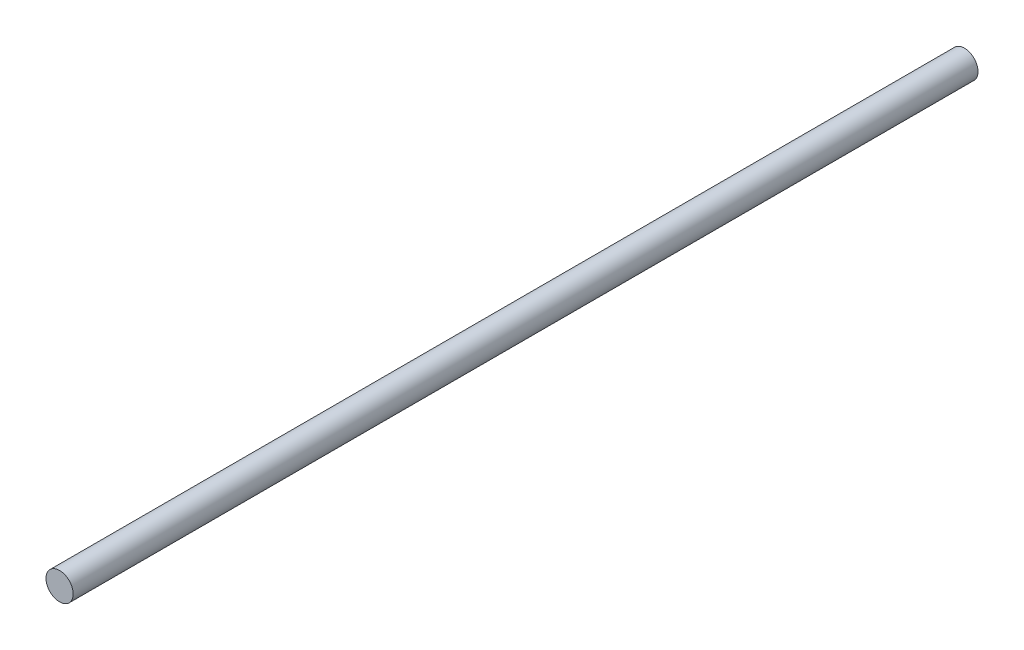
ISO-10303-21;
HEADER;
FILE_DESCRIPTION(('STEP AP214'),'2;1');
FILE_NAME('part.step','',(''),(''),'','','');
FILE_SCHEMA(('AUTOMOTIVE_DESIGN { 1 0 10303 214 1 1 1 1 }'));
ENDSEC;
DATA;
#1=APPLICATION_CONTEXT('core data for automotive mechanical design processes');
#2=APPLICATION_PROTOCOL_DEFINITION('international standard','automotive_design',2000,#1);
#3=PRODUCT_CONTEXT('',#1,'mechanical');
#4=PRODUCT('Part','Part','',(#3));
#5=PRODUCT_RELATED_PRODUCT_CATEGORY('part','',(#4));
#6=PRODUCT_DEFINITION_FORMATION('','',#4);
#7=PRODUCT_DEFINITION_CONTEXT('part definition',#1,'design');
#8=PRODUCT_DEFINITION('design','',#6,#7);
#9=PRODUCT_DEFINITION_SHAPE('','',#8);
#10=(LENGTH_UNIT() NAMED_UNIT(*) SI_UNIT(.MILLI.,.METRE.));
#11=(NAMED_UNIT(*) PLANE_ANGLE_UNIT() SI_UNIT($,.RADIAN.));
#12=(NAMED_UNIT(*) SI_UNIT($,.STERADIAN.) SOLID_ANGLE_UNIT());
#13=UNCERTAINTY_MEASURE_WITH_UNIT(LENGTH_MEASURE(1.E-05),#10,'distance_accuracy_value','');
#14=(GEOMETRIC_REPRESENTATION_CONTEXT(3) GLOBAL_UNCERTAINTY_ASSIGNED_CONTEXT((#13)) GLOBAL_UNIT_ASSIGNED_CONTEXT((#10,
#11,#12)) REPRESENTATION_CONTEXT('',''));
#15=CARTESIAN_POINT('',(0.,0.,0.));
#16=DIRECTION('',(0.,0.,1.));
#17=DIRECTION('',(1.,0.,0.));
#18=AXIS2_PLACEMENT_3D('',#15,#16,#17);
#19=CARTESIAN_POINT('',(0.,0.,199.5));
#20=DIRECTION('',(0.,0.,-1.));
#21=DIRECTION('',(-1.,0.,0.));
#22=AXIS2_PLACEMENT_3D('',#19,#20,#21);
#23=CYLINDRICAL_SURFACE('',#22,3.);
#24=CARTESIAN_POINT('',(0.,0.,199.5));
#25=DIRECTION('',(0.,0.,1.));
#26=DIRECTION('',(1.,0.,0.));
#27=AXIS2_PLACEMENT_3D('',#24,#25,#26);
#28=CIRCLE('',#27,3.);
#29=CARTESIAN_POINT('',(3.,0.,199.5));
#30=VERTEX_POINT('',#29);
#31=EDGE_CURVE('E10',#30,#30,#28,.T.);
#32=ORIENTED_EDGE('',*,*,#31,.F.);
#33=EDGE_LOOP('',(#32));
#34=FACE_BOUND('',#33,.T.);
#35=CARTESIAN_POINT('',(0.,0.,0.));
#36=DIRECTION('',(0.,0.,1.));
#37=DIRECTION('',(1.,0.,0.));
#38=AXIS2_PLACEMENT_3D('',#35,#36,#37);
#39=CIRCLE('',#38,3.);
#40=CARTESIAN_POINT('',(3.,0.,0.));
#41=VERTEX_POINT('',#40);
#42=EDGE_CURVE('E34',#41,#41,#39,.T.);
#43=ORIENTED_EDGE('',*,*,#42,.T.);
#44=EDGE_LOOP('',(#43));
#45=FACE_BOUND('',#44,.T.);
#46=ADVANCED_FACE('F31',(#34,#45),#23,.T.);
#47=CARTESIAN_POINT('',(0.,0.,199.5));
#48=DIRECTION('',(0.,0.,1.));
#49=DIRECTION('',(1.,0.,0.));
#50=AXIS2_PLACEMENT_3D('',#47,#48,#49);
#51=PLANE('',#50);
#52=ORIENTED_EDGE('',*,*,#31,.T.);
#53=EDGE_LOOP('',(#52));
#54=FACE_BOUND('',#53,.T.);
#55=ADVANCED_FACE('F46',(#54),#51,.T.);
#56=CARTESIAN_POINT('',(0.,0.,0.));
#57=DIRECTION('',(0.,0.,1.));
#58=DIRECTION('',(1.,0.,0.));
#59=AXIS2_PLACEMENT_3D('',#56,#57,#58);
#60=PLANE('',#59);
#61=ORIENTED_EDGE('',*,*,#42,.F.);
#62=EDGE_LOOP('',(#61));
#63=FACE_BOUND('',#62,.T.);
#64=ADVANCED_FACE('F44',(#63),#60,.F.);
#65=CLOSED_SHELL('',(#46,#55,#64));
#66=MANIFOLD_SOLID_BREP('B2',#65);
#67=ADVANCED_BREP_SHAPE_REPRESENTATION('',(#18,#66),#14);
#68=SHAPE_DEFINITION_REPRESENTATION(#9,#67);
ENDSEC;
END-ISO-10303-21;
